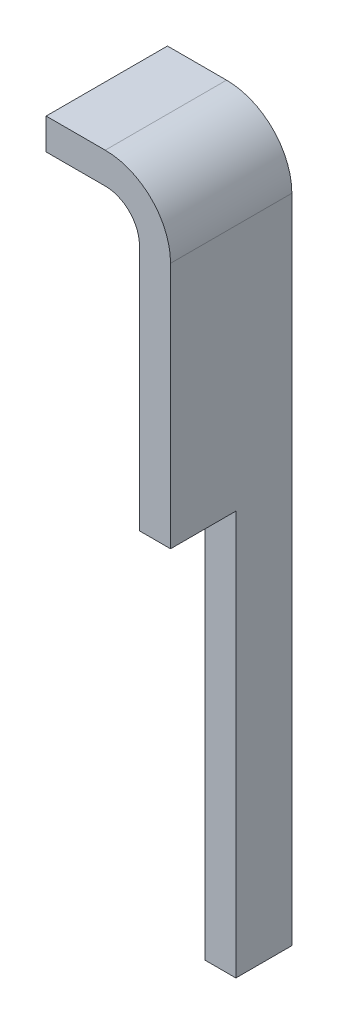
ISO-10303-21;
HEADER;
FILE_DESCRIPTION(('STEP AP214'),'2;1');
FILE_NAME('part.step','',(''),(''),'','','');
FILE_SCHEMA(('AUTOMOTIVE_DESIGN { 1 0 10303 214 1 1 1 1 }'));
ENDSEC;
DATA;
#1=APPLICATION_CONTEXT('core data for automotive mechanical design processes');
#2=APPLICATION_PROTOCOL_DEFINITION('international standard','automotive_design',2000,#1);
#3=PRODUCT_CONTEXT('',#1,'mechanical');
#4=PRODUCT('Part','Part','',(#3));
#5=PRODUCT_RELATED_PRODUCT_CATEGORY('part','',(#4));
#6=PRODUCT_DEFINITION_FORMATION('','',#4);
#7=PRODUCT_DEFINITION_CONTEXT('part definition',#1,'design');
#8=PRODUCT_DEFINITION('design','',#6,#7);
#9=PRODUCT_DEFINITION_SHAPE('','',#8);
#10=(LENGTH_UNIT() NAMED_UNIT(*) SI_UNIT(.MILLI.,.METRE.));
#11=(NAMED_UNIT(*) PLANE_ANGLE_UNIT() SI_UNIT($,.RADIAN.));
#12=(NAMED_UNIT(*) SI_UNIT($,.STERADIAN.) SOLID_ANGLE_UNIT());
#13=UNCERTAINTY_MEASURE_WITH_UNIT(LENGTH_MEASURE(1.E-05),#10,'distance_accuracy_value','');
#14=(GEOMETRIC_REPRESENTATION_CONTEXT(3) GLOBAL_UNCERTAINTY_ASSIGNED_CONTEXT((#13)) GLOBAL_UNIT_ASSIGNED_CONTEXT((#10,
#11,#12)) REPRESENTATION_CONTEXT('',''));
#15=CARTESIAN_POINT('',(0.,0.,0.));
#16=DIRECTION('',(0.,0.,1.));
#17=DIRECTION('',(1.,0.,0.));
#18=AXIS2_PLACEMENT_3D('',#15,#16,#17);
#19=CARTESIAN_POINT('',(0.508,-5.7277,-0.762));
#20=DIRECTION('',(0.,-1.,0.));
#21=DIRECTION('',(0.,0.,-1.));
#22=AXIS2_PLACEMENT_3D('',#19,#20,#21);
#23=PLANE('',#22);
#24=DIRECTION('',(1.,0.,0.));
#25=VECTOR('',#24,1.);
#26=CARTESIAN_POINT('',(0.508,-5.7277,-0.2286));
#27=LINE('',#26,#25);
#28=CARTESIAN_POINT('',(0.508,-5.7277,-0.2286));
#29=VERTEX_POINT('',#28);
#30=CARTESIAN_POINT('',(0.762,-5.7277,-0.2286));
#31=VERTEX_POINT('',#30);
#32=EDGE_CURVE('E149',#29,#31,#27,.T.);
#33=ORIENTED_EDGE('',*,*,#32,.T.);
#34=DIRECTION('',(0.,0.,1.));
#35=VECTOR('',#34,1.);
#36=CARTESIAN_POINT('',(0.762,-5.7277,-0.2286));
#37=LINE('',#36,#35);
#38=CARTESIAN_POINT('',(0.762,-5.7277,0.2286));
#39=VERTEX_POINT('',#38);
#40=EDGE_CURVE('E185',#31,#39,#37,.T.);
#41=ORIENTED_EDGE('',*,*,#40,.T.);
#42=DIRECTION('',(1.,0.,0.));
#43=VECTOR('',#42,1.);
#44=CARTESIAN_POINT('',(0.508,-5.7277,0.2286));
#45=LINE('',#44,#43);
#46=CARTESIAN_POINT('',(0.508,-5.7277,0.2286));
#47=VERTEX_POINT('',#46);
#48=EDGE_CURVE('E11',#47,#39,#45,.T.);
#49=ORIENTED_EDGE('',*,*,#48,.F.);
#50=DIRECTION('',(0.,0.,1.));
#51=VECTOR('',#50,1.);
#52=CARTESIAN_POINT('',(0.508,-5.7277,-0.2286));
#53=LINE('',#52,#51);
#54=EDGE_CURVE('E197',#29,#47,#53,.T.);
#55=ORIENTED_EDGE('',*,*,#54,.F.);
#56=EDGE_LOOP('',(#33,#41,#49,#55));
#57=FACE_BOUND('',#56,.T.);
#58=ADVANCED_FACE('F17',(#57),#23,.T.);
#59=CARTESIAN_POINT('',(0.762,-5.7277,0.2286));
#60=DIRECTION('',(0.,0.,-1.));
#61=DIRECTION('',(0.,-1.,0.));
#62=AXIS2_PLACEMENT_3D('',#59,#60,#61);
#63=PLANE('',#62);
#64=DIRECTION('',(0.,1.,0.));
#65=VECTOR('',#64,1.);
#66=CARTESIAN_POINT('',(0.762,-5.7277,0.2286));
#67=LINE('',#66,#65);
#68=CARTESIAN_POINT('',(0.762,-2.4257,0.2286));
#69=VERTEX_POINT('',#68);
#70=EDGE_CURVE('E193',#39,#69,#67,.T.);
#71=ORIENTED_EDGE('',*,*,#70,.T.);
#72=DIRECTION('',(-1.,0.,0.));
#73=VECTOR('',#72,1.);
#74=CARTESIAN_POINT('',(0.762,-2.4257,0.2286));
#75=LINE('',#74,#73);
#76=CARTESIAN_POINT('',(0.508,-2.4257,0.2286));
#77=VERTEX_POINT('',#76);
#78=EDGE_CURVE('E191',#69,#77,#75,.T.);
#79=ORIENTED_EDGE('',*,*,#78,.T.);
#80=DIRECTION('',(0.,1.,0.));
#81=VECTOR('',#80,1.);
#82=CARTESIAN_POINT('',(0.508,-5.7277,0.2286));
#83=LINE('',#82,#81);
#84=EDGE_CURVE('E28',#47,#77,#83,.T.);
#85=ORIENTED_EDGE('',*,*,#84,.F.);
#86=ORIENTED_EDGE('',*,*,#48,.T.);
#87=EDGE_LOOP('',(#71,#79,#85,#86));
#88=FACE_BOUND('',#87,.T.);
#89=ADVANCED_FACE('F239',(#88),#63,.F.);
#90=CARTESIAN_POINT('',(0.508,-0.4064,-0.762));
#91=DIRECTION('',(-1.,0.,0.));
#92=DIRECTION('',(0.,0.,1.));
#93=AXIS2_PLACEMENT_3D('',#90,#91,#92);
#94=PLANE('',#93);
#95=DIRECTION('',(0.,-1.,0.));
#96=VECTOR('',#95,1.);
#97=CARTESIAN_POINT('',(0.508,-0.4064,-0.2286));
#98=LINE('',#97,#96);
#99=CARTESIAN_POINT('',(0.508,-0.4064,-0.2286));
#100=VERTEX_POINT('',#99);
#101=EDGE_CURVE('E21',#100,#29,#98,.T.);
#102=ORIENTED_EDGE('',*,*,#101,.T.);
#103=ORIENTED_EDGE('',*,*,#54,.T.);
#104=ORIENTED_EDGE('',*,*,#84,.T.);
#105=DIRECTION('',(0.,0.,-1.));
#106=VECTOR('',#105,1.);
#107=CARTESIAN_POINT('',(0.508,-2.4257,0.762));
#108=LINE('',#107,#106);
#109=CARTESIAN_POINT('',(0.508,-2.4257,0.762));
#110=VERTEX_POINT('',#109);
#111=EDGE_CURVE('E162',#110,#77,#108,.T.);
#112=ORIENTED_EDGE('',*,*,#111,.F.);
#113=DIRECTION('',(0.,-1.,0.));
#114=VECTOR('',#113,1.);
#115=CARTESIAN_POINT('',(0.508,-0.4064,0.762));
#116=LINE('',#115,#114);
#117=CARTESIAN_POINT('',(0.508,-0.4064,0.762));
#118=VERTEX_POINT('',#117);
#119=EDGE_CURVE('E158',#118,#110,#116,.T.);
#120=ORIENTED_EDGE('',*,*,#119,.F.);
#121=DIRECTION('',(0.,0.,1.));
#122=VECTOR('',#121,1.);
#123=CARTESIAN_POINT('',(0.508,-0.4064,-0.2286));
#124=LINE('',#123,#122);
#125=EDGE_CURVE('E125',#100,#118,#124,.T.);
#126=ORIENTED_EDGE('',*,*,#125,.F.);
#127=EDGE_LOOP('',(#102,#103,#104,#112,#120,#126));
#128=FACE_BOUND('',#127,.T.);
#129=ADVANCED_FACE('F241',(#128),#94,.T.);
#130=CARTESIAN_POINT('',(0.2286,-0.4064,-0.762));
#131=DIRECTION('',(0.,0.,1.));
#132=DIRECTION('',(1.,0.,0.));
#133=AXIS2_PLACEMENT_3D('',#130,#131,#132);
#134=CYLINDRICAL_SURFACE('',#133,0.2794);
#135=CARTESIAN_POINT('',(0.2286,-0.4064,-0.2286));
#136=DIRECTION('',(0.,0.,1.));
#137=DIRECTION('',(1.,0.,0.));
#138=AXIS2_PLACEMENT_3D('',#135,#136,#137);
#139=CIRCLE('',#138,0.2794);
#140=CARTESIAN_POINT('',(0.2286,-0.127,-0.2286));
#141=VERTEX_POINT('',#140);
#142=EDGE_CURVE('E117',#100,#141,#139,.T.);
#143=ORIENTED_EDGE('',*,*,#142,.F.);
#144=ORIENTED_EDGE('',*,*,#125,.T.);
#145=CARTESIAN_POINT('',(0.2286,-0.4064,0.762));
#146=DIRECTION('',(0.,0.,-1.));
#147=DIRECTION('',(0.,1.,0.));
#148=AXIS2_PLACEMENT_3D('',#145,#146,#147);
#149=CIRCLE('',#148,0.2794);
#150=CARTESIAN_POINT('',(0.2286,-0.127,0.762));
#151=VERTEX_POINT('',#150);
#152=EDGE_CURVE('E120',#151,#118,#149,.T.);
#153=ORIENTED_EDGE('',*,*,#152,.F.);
#154=DIRECTION('',(0.,0.,1.));
#155=VECTOR('',#154,1.);
#156=CARTESIAN_POINT('',(0.2286,-0.127,-0.2286));
#157=LINE('',#156,#155);
#158=EDGE_CURVE('E113',#141,#151,#157,.T.);
#159=ORIENTED_EDGE('',*,*,#158,.F.);
#160=EDGE_LOOP('',(#143,#144,#153,#159));
#161=FACE_BOUND('',#160,.T.);
#162=ADVANCED_FACE('F115',(#161),#134,.F.);
#163=CARTESIAN_POINT('',(0.,-0.127,-0.762));
#164=DIRECTION('',(0.,-1.,0.));
#165=DIRECTION('',(0.,0.,-1.));
#166=AXIS2_PLACEMENT_3D('',#163,#164,#165);
#167=PLANE('',#166);
#168=DIRECTION('',(1.,0.,0.));
#169=VECTOR('',#168,1.);
#170=CARTESIAN_POINT('',(0.,-0.127,-0.2286));
#171=LINE('',#170,#169);
#172=CARTESIAN_POINT('',(-0.254,-0.127,-0.2286));
#173=VERTEX_POINT('',#172);
#174=EDGE_CURVE('E129',#173,#141,#171,.T.);
#175=ORIENTED_EDGE('',*,*,#174,.T.);
#176=ORIENTED_EDGE('',*,*,#158,.T.);
#177=DIRECTION('',(1.,0.,0.));
#178=VECTOR('',#177,1.);
#179=CARTESIAN_POINT('',(0.,-0.127,0.762));
#180=LINE('',#179,#178);
#181=CARTESIAN_POINT('',(-0.254,-0.127,0.762));
#182=VERTEX_POINT('',#181);
#183=EDGE_CURVE('E165',#182,#151,#180,.T.);
#184=ORIENTED_EDGE('',*,*,#183,.F.);
#185=DIRECTION('',(0.,0.,1.));
#186=VECTOR('',#185,1.);
#187=CARTESIAN_POINT('',(-0.254,-0.127,0.762));
#188=LINE('',#187,#186);
#189=EDGE_CURVE('E132',#173,#182,#188,.T.);
#190=ORIENTED_EDGE('',*,*,#189,.F.);
#191=EDGE_LOOP('',(#175,#176,#184,#190));
#192=FACE_BOUND('',#191,.T.);
#193=ADVANCED_FACE('F130',(#192),#167,.T.);
#194=CARTESIAN_POINT('',(0.2286,0.127,-0.762));
#195=DIRECTION('',(0.,1.,0.));
#196=DIRECTION('',(1.,0.,0.));
#197=AXIS2_PLACEMENT_3D('',#194,#195,#196);
#198=PLANE('',#197);
#199=DIRECTION('',(-1.,0.,0.));
#200=VECTOR('',#199,1.);
#201=CARTESIAN_POINT('',(0.2286,0.127,-0.2286));
#202=LINE('',#201,#200);
#203=CARTESIAN_POINT('',(0.2286,0.127,-0.2286));
#204=VERTEX_POINT('',#203);
#205=CARTESIAN_POINT('',(-0.254,0.127,-0.2286));
#206=VERTEX_POINT('',#205);
#207=EDGE_CURVE('E137',#204,#206,#202,.T.);
#208=ORIENTED_EDGE('',*,*,#207,.T.);
#209=DIRECTION('',(0.,0.,-1.));
#210=VECTOR('',#209,1.);
#211=CARTESIAN_POINT('',(-0.254,0.127,-0.2286));
#212=LINE('',#211,#210);
#213=CARTESIAN_POINT('',(-0.254,0.127,0.762));
#214=VERTEX_POINT('',#213);
#215=EDGE_CURVE('E212',#214,#206,#212,.T.);
#216=ORIENTED_EDGE('',*,*,#215,.F.);
#217=DIRECTION('',(-1.,0.,0.));
#218=VECTOR('',#217,1.);
#219=CARTESIAN_POINT('',(0.2286,0.127,0.762));
#220=LINE('',#219,#218);
#221=CARTESIAN_POINT('',(0.2286,0.127,0.762));
#222=VERTEX_POINT('',#221);
#223=EDGE_CURVE('E163',#222,#214,#220,.T.);
#224=ORIENTED_EDGE('',*,*,#223,.F.);
#225=DIRECTION('',(0.,0.,1.));
#226=VECTOR('',#225,1.);
#227=CARTESIAN_POINT('',(0.2286,0.127,-0.2286));
#228=LINE('',#227,#226);
#229=EDGE_CURVE('E126',#204,#222,#228,.T.);
#230=ORIENTED_EDGE('',*,*,#229,.F.);
#231=EDGE_LOOP('',(#208,#216,#224,#230));
#232=FACE_BOUND('',#231,.T.);
#233=ADVANCED_FACE('F262',(#232),#198,.T.);
#234=CARTESIAN_POINT('',(0.2286,-0.4064,-0.762));
#235=DIRECTION('',(0.,0.,1.));
#236=DIRECTION('',(1.,0.,0.));
#237=AXIS2_PLACEMENT_3D('',#234,#235,#236);
#238=CYLINDRICAL_SURFACE('',#237,0.5334);
#239=CARTESIAN_POINT('',(0.2286,-0.4064,-0.2286));
#240=DIRECTION('',(0.,0.,1.));
#241=DIRECTION('',(1.,0.,0.));
#242=AXIS2_PLACEMENT_3D('',#239,#240,#241);
#243=CIRCLE('',#242,0.5334);
#244=CARTESIAN_POINT('',(0.762,-0.4064,-0.2286));
#245=VERTEX_POINT('',#244);
#246=EDGE_CURVE('E176',#245,#204,#243,.T.);
#247=ORIENTED_EDGE('',*,*,#246,.T.);
#248=ORIENTED_EDGE('',*,*,#229,.T.);
#249=CARTESIAN_POINT('',(0.2286,-0.4064,0.762));
#250=DIRECTION('',(0.,0.,1.));
#251=DIRECTION('',(1.,0.,0.));
#252=AXIS2_PLACEMENT_3D('',#249,#250,#251);
#253=CIRCLE('',#252,0.5334);
#254=CARTESIAN_POINT('',(0.762,-0.4064,0.762));
#255=VERTEX_POINT('',#254);
#256=EDGE_CURVE('E166',#255,#222,#253,.T.);
#257=ORIENTED_EDGE('',*,*,#256,.F.);
#258=DIRECTION('',(0.,0.,1.));
#259=VECTOR('',#258,1.);
#260=CARTESIAN_POINT('',(0.762,-0.4064,-0.2286));
#261=LINE('',#260,#259);
#262=EDGE_CURVE('E156',#245,#255,#261,.T.);
#263=ORIENTED_EDGE('',*,*,#262,.F.);
#264=EDGE_LOOP('',(#247,#248,#257,#263));
#265=FACE_BOUND('',#264,.T.);
#266=ADVANCED_FACE('F19',(#265),#238,.T.);
#267=CARTESIAN_POINT('',(0.762,-5.7277,-0.2286));
#268=DIRECTION('',(0.,0.,-1.));
#269=DIRECTION('',(0.,-1.,0.));
#270=AXIS2_PLACEMENT_3D('',#267,#268,#269);
#271=PLANE('',#270);
#272=DIRECTION('',(0.,1.,0.));
#273=VECTOR('',#272,1.);
#274=CARTESIAN_POINT('',(0.762,-5.7277,-0.2286));
#275=LINE('',#274,#273);
#276=EDGE_CURVE('E153',#31,#245,#275,.T.);
#277=ORIENTED_EDGE('',*,*,#276,.F.);
#278=ORIENTED_EDGE('',*,*,#32,.F.);
#279=ORIENTED_EDGE('',*,*,#101,.F.);
#280=ORIENTED_EDGE('',*,*,#142,.T.);
#281=ORIENTED_EDGE('',*,*,#174,.F.);
#282=DIRECTION('',(0.,-1.,0.));
#283=VECTOR('',#282,1.);
#284=CARTESIAN_POINT('',(-0.254,-0.127,-0.2286));
#285=LINE('',#284,#283);
#286=EDGE_CURVE('E182',#206,#173,#285,.T.);
#287=ORIENTED_EDGE('',*,*,#286,.F.);
#288=ORIENTED_EDGE('',*,*,#207,.F.);
#289=ORIENTED_EDGE('',*,*,#246,.F.);
#290=EDGE_LOOP('',(#277,#278,#279,#280,#281,#287,#288,#289));
#291=FACE_BOUND('',#290,.T.);
#292=ADVANCED_FACE('F140',(#291),#271,.T.);
#293=CARTESIAN_POINT('',(0.762,-5.7277,-0.762));
#294=DIRECTION('',(1.,0.,0.));
#295=DIRECTION('',(0.,1.,0.));
#296=AXIS2_PLACEMENT_3D('',#293,#294,#295);
#297=PLANE('',#296);
#298=ORIENTED_EDGE('',*,*,#276,.T.);
#299=ORIENTED_EDGE('',*,*,#262,.T.);
#300=DIRECTION('',(0.,1.,0.));
#301=VECTOR('',#300,1.);
#302=CARTESIAN_POINT('',(0.762,-2.4257,0.762));
#303=LINE('',#302,#301);
#304=CARTESIAN_POINT('',(0.762,-2.4257,0.762));
#305=VERTEX_POINT('',#304);
#306=EDGE_CURVE('E172',#305,#255,#303,.T.);
#307=ORIENTED_EDGE('',*,*,#306,.F.);
#308=DIRECTION('',(0.,0.,-1.));
#309=VECTOR('',#308,1.);
#310=CARTESIAN_POINT('',(0.762,-2.4257,0.762));
#311=LINE('',#310,#309);
#312=EDGE_CURVE('E157',#305,#69,#311,.T.);
#313=ORIENTED_EDGE('',*,*,#312,.T.);
#314=ORIENTED_EDGE('',*,*,#70,.F.);
#315=ORIENTED_EDGE('',*,*,#40,.F.);
#316=EDGE_LOOP('',(#298,#299,#307,#313,#314,#315));
#317=FACE_BOUND('',#316,.T.);
#318=ADVANCED_FACE('F235',(#317),#297,.T.);
#319=CARTESIAN_POINT('',(0.762,-2.4257,0.2286));
#320=DIRECTION('',(0.,1.,0.));
#321=DIRECTION('',(1.,0.,0.));
#322=AXIS2_PLACEMENT_3D('',#319,#320,#321);
#323=PLANE('',#322);
#324=DIRECTION('',(1.,0.,0.));
#325=VECTOR('',#324,1.);
#326=CARTESIAN_POINT('',(0.508,-2.4257,0.762));
#327=LINE('',#326,#325);
#328=EDGE_CURVE('E168',#110,#305,#327,.T.);
#329=ORIENTED_EDGE('',*,*,#328,.F.);
#330=ORIENTED_EDGE('',*,*,#111,.T.);
#331=ORIENTED_EDGE('',*,*,#78,.F.);
#332=ORIENTED_EDGE('',*,*,#312,.F.);
#333=EDGE_LOOP('',(#329,#330,#331,#332));
#334=FACE_BOUND('',#333,.T.);
#335=ADVANCED_FACE('F252',(#334),#323,.F.);
#336=CARTESIAN_POINT('',(0.,0.,0.762));
#337=DIRECTION('',(0.,0.,1.));
#338=DIRECTION('',(1.,0.,0.));
#339=AXIS2_PLACEMENT_3D('',#336,#337,#338);
#340=PLANE('',#339);
#341=ORIENTED_EDGE('',*,*,#328,.T.);
#342=ORIENTED_EDGE('',*,*,#306,.T.);
#343=ORIENTED_EDGE('',*,*,#256,.T.);
#344=ORIENTED_EDGE('',*,*,#223,.T.);
#345=DIRECTION('',(0.,1.,0.));
#346=VECTOR('',#345,1.);
#347=CARTESIAN_POINT('',(-0.254,0.127,0.762));
#348=LINE('',#347,#346);
#349=EDGE_CURVE('E173',#182,#214,#348,.T.);
#350=ORIENTED_EDGE('',*,*,#349,.F.);
#351=ORIENTED_EDGE('',*,*,#183,.T.);
#352=ORIENTED_EDGE('',*,*,#152,.T.);
#353=ORIENTED_EDGE('',*,*,#119,.T.);
#354=EDGE_LOOP('',(#341,#342,#343,#344,#350,#351,#352,#353));
#355=FACE_BOUND('',#354,.T.);
#356=ADVANCED_FACE('F249',(#355),#340,.T.);
#357=CARTESIAN_POINT('',(-0.254,0.,0.2667));
#358=DIRECTION('',(-1.,0.,0.));
#359=DIRECTION('',(0.,0.,1.));
#360=AXIS2_PLACEMENT_3D('',#357,#358,#359);
#361=PLANE('',#360);
#362=ORIENTED_EDGE('',*,*,#215,.T.);
#363=ORIENTED_EDGE('',*,*,#286,.T.);
#364=ORIENTED_EDGE('',*,*,#189,.T.);
#365=ORIENTED_EDGE('',*,*,#349,.T.);
#366=EDGE_LOOP('',(#362,#363,#364,#365));
#367=FACE_BOUND('',#366,.T.);
#368=ADVANCED_FACE('F309',(#367),#361,.T.);
#369=CLOSED_SHELL('',(#58,#89,#129,#162,#193,#233,#266,#292,#318,#335,#356,#368));
#370=MANIFOLD_SOLID_BREP('B1',#369);
#371=ADVANCED_BREP_SHAPE_REPRESENTATION('',(#18,#370),#14);
#372=SHAPE_DEFINITION_REPRESENTATION(#9,#371);
ENDSEC;
END-ISO-10303-21;
